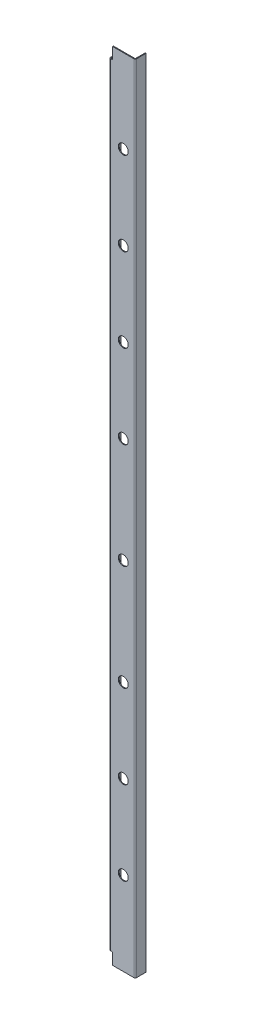
ISO-10303-21;
HEADER;
FILE_DESCRIPTION(('STEP AP214'),'2;1');
FILE_NAME('part.step','',(''),(''),'','','');
FILE_SCHEMA(('AUTOMOTIVE_DESIGN { 1 0 10303 214 1 1 1 1 }'));
ENDSEC;
DATA;
#1=APPLICATION_CONTEXT('core data for automotive mechanical design processes');
#2=APPLICATION_PROTOCOL_DEFINITION('international standard','automotive_design',2000,#1);
#3=PRODUCT_CONTEXT('',#1,'mechanical');
#4=PRODUCT('Part','Part','',(#3));
#5=PRODUCT_RELATED_PRODUCT_CATEGORY('part','',(#4));
#6=PRODUCT_DEFINITION_FORMATION('','',#4);
#7=PRODUCT_DEFINITION_CONTEXT('part definition',#1,'design');
#8=PRODUCT_DEFINITION('design','',#6,#7);
#9=PRODUCT_DEFINITION_SHAPE('','',#8);
#10=(LENGTH_UNIT() NAMED_UNIT(*) SI_UNIT(.MILLI.,.METRE.));
#11=(NAMED_UNIT(*) PLANE_ANGLE_UNIT() SI_UNIT($,.RADIAN.));
#12=(NAMED_UNIT(*) SI_UNIT($,.STERADIAN.) SOLID_ANGLE_UNIT());
#13=UNCERTAINTY_MEASURE_WITH_UNIT(LENGTH_MEASURE(1.E-05),#10,'distance_accuracy_value','');
#14=(GEOMETRIC_REPRESENTATION_CONTEXT(3) GLOBAL_UNCERTAINTY_ASSIGNED_CONTEXT((#13)) GLOBAL_UNIT_ASSIGNED_CONTEXT((#10,
#11,#12)) REPRESENTATION_CONTEXT('',''));
#15=CARTESIAN_POINT('',(0.,0.,0.));
#16=DIRECTION('',(0.,0.,1.));
#17=DIRECTION('',(1.,0.,0.));
#18=AXIS2_PLACEMENT_3D('',#15,#16,#17);
#19=CARTESIAN_POINT('',(-1.2,17.5,-15.));
#20=DIRECTION('',(0.,1.,0.));
#21=DIRECTION('',(0.,0.,1.));
#22=AXIS2_PLACEMENT_3D('',#19,#20,#21);
#23=PLANE('',#22);
#24=DIRECTION('',(0.,0.,1.));
#25=VECTOR('',#24,1.);
#26=CARTESIAN_POINT('',(0.,17.5000000000001,0.));
#27=LINE('',#26,#25);
#28=CARTESIAN_POINT('',(0.,17.5,-15.));
#29=VERTEX_POINT('',#28);
#30=CARTESIAN_POINT('',(0.,17.5000000000001,-0.7));
#31=VERTEX_POINT('',#30);
#32=EDGE_CURVE('E435',#29,#31,#27,.T.);
#33=ORIENTED_EDGE('',*,*,#32,.T.);
#34=DIRECTION('',(-1.,0.,0.));
#35=VECTOR('',#34,1.);
#36=CARTESIAN_POINT('',(0.,17.5000000000001,-0.7));
#37=LINE('',#36,#35);
#38=CARTESIAN_POINT('',(-1.2,17.5000000000001,-0.7));
#39=VERTEX_POINT('',#38);
#40=EDGE_CURVE('E12',#31,#39,#37,.T.);
#41=ORIENTED_EDGE('',*,*,#40,.T.);
#42=DIRECTION('',(0.,0.,1.));
#43=VECTOR('',#42,1.);
#44=CARTESIAN_POINT('',(-1.2,17.5,-15.));
#45=LINE('',#44,#43);
#46=CARTESIAN_POINT('',(-1.2,17.5,-15.));
#47=VERTEX_POINT('',#46);
#48=EDGE_CURVE('E161',#47,#39,#45,.T.);
#49=ORIENTED_EDGE('',*,*,#48,.F.);
#50=DIRECTION('',(-1.,0.,0.));
#51=VECTOR('',#50,1.);
#52=CARTESIAN_POINT('',(-1.2,17.5,-15.));
#53=LINE('',#52,#51);
#54=EDGE_CURVE('E164',#29,#47,#53,.T.);
#55=ORIENTED_EDGE('',*,*,#54,.F.);
#56=EDGE_LOOP('',(#33,#41,#49,#55));
#57=FACE_BOUND('',#56,.T.);
#58=ADVANCED_FACE('F45',(#57),#23,.F.);
#59=DIRECTION('',(-1.,0.,0.));
#60=VECTOR('',#59,1.);
#61=CARTESIAN_POINT('',(-1.2,17.5,1.2));
#62=LINE('',#61,#60);
#63=CARTESIAN_POINT('',(3.8,17.5,1.2));
#64=VERTEX_POINT('',#63);
#65=CARTESIAN_POINT('',(0.7,17.5,1.2));
#66=VERTEX_POINT('',#65);
#67=EDGE_CURVE('E184',#64,#66,#62,.T.);
#68=ORIENTED_EDGE('',*,*,#67,.T.);
#69=DIRECTION('',(0.,0.,-1.));
#70=VECTOR('',#69,1.);
#71=CARTESIAN_POINT('',(0.7,17.5,1.2));
#72=LINE('',#71,#70);
#73=CARTESIAN_POINT('',(0.7,17.5000000000001,0.));
#74=VERTEX_POINT('',#73);
#75=EDGE_CURVE('E55',#66,#74,#72,.T.);
#76=ORIENTED_EDGE('',*,*,#75,.T.);
#77=DIRECTION('',(1.,0.,0.));
#78=VECTOR('',#77,1.);
#79=CARTESIAN_POINT('',(0.,17.5000000000001,0.));
#80=LINE('',#79,#78);
#81=CARTESIAN_POINT('',(3.8,17.5,0.));
#82=VERTEX_POINT('',#81);
#83=EDGE_CURVE('E385',#74,#82,#80,.T.);
#84=ORIENTED_EDGE('',*,*,#83,.T.);
#85=DIRECTION('',(0.,0.,1.));
#86=VECTOR('',#85,1.);
#87=CARTESIAN_POINT('',(3.8,17.5,-15.));
#88=LINE('',#87,#86);
#89=EDGE_CURVE('E173',#82,#64,#88,.T.);
#90=ORIENTED_EDGE('',*,*,#89,.T.);
#91=EDGE_LOOP('',(#68,#76,#84,#90));
#92=FACE_BOUND('',#91,.T.);
#93=ADVANCED_FACE('F407',(#92),#23,.F.);
#94=CARTESIAN_POINT('',(-1.20000000000014,1182.5,-15.));
#95=DIRECTION('',(0.,-1.,0.));
#96=DIRECTION('',(0.,0.,-1.));
#97=AXIS2_PLACEMENT_3D('',#94,#95,#96);
#98=PLANE('',#97);
#99=DIRECTION('',(0.,0.,1.));
#100=VECTOR('',#99,1.);
#101=CARTESIAN_POINT('',(-1.20000000000014,1182.5,-15.));
#102=LINE('',#101,#100);
#103=CARTESIAN_POINT('',(-1.20000000000014,1182.5,-15.));
#104=VERTEX_POINT('',#103);
#105=CARTESIAN_POINT('',(-1.20000000000014,1182.5,-0.699999999999999));
#106=VERTEX_POINT('',#105);
#107=EDGE_CURVE('E189',#104,#106,#102,.T.);
#108=ORIENTED_EDGE('',*,*,#107,.T.);
#109=DIRECTION('',(1.,0.,0.));
#110=VECTOR('',#109,1.);
#111=CARTESIAN_POINT('',(-1.20000000000014,1182.5,-0.699999999999999));
#112=LINE('',#111,#110);
#113=CARTESIAN_POINT('',(0.,1182.5,-0.7));
#114=VERTEX_POINT('',#113);
#115=EDGE_CURVE('E252',#106,#114,#112,.T.);
#116=ORIENTED_EDGE('',*,*,#115,.T.);
#117=DIRECTION('',(0.,0.,-1.));
#118=VECTOR('',#117,1.);
#119=CARTESIAN_POINT('',(0.,1182.5,0.));
#120=LINE('',#119,#118);
#121=CARTESIAN_POINT('',(0.,1182.5,-15.));
#122=VERTEX_POINT('',#121);
#123=EDGE_CURVE('E449',#114,#122,#120,.T.);
#124=ORIENTED_EDGE('',*,*,#123,.T.);
#125=DIRECTION('',(1.,0.,0.));
#126=VECTOR('',#125,1.);
#127=CARTESIAN_POINT('',(-1.20000000000014,1182.5,-15.));
#128=LINE('',#127,#126);
#129=EDGE_CURVE('E526',#104,#122,#128,.T.);
#130=ORIENTED_EDGE('',*,*,#129,.F.);
#131=EDGE_LOOP('',(#108,#116,#124,#130));
#132=FACE_BOUND('',#131,.T.);
#133=ADVANCED_FACE('F413',(#132),#98,.F.);
#134=DIRECTION('',(-1.,0.,0.));
#135=VECTOR('',#134,1.);
#136=CARTESIAN_POINT('',(0.,1182.5,0.));
#137=LINE('',#136,#135);
#138=CARTESIAN_POINT('',(3.79999999999986,1182.5,0.));
#139=VERTEX_POINT('',#138);
#140=CARTESIAN_POINT('',(0.7,1182.5,0.));
#141=VERTEX_POINT('',#140);
#142=EDGE_CURVE('E462',#139,#141,#137,.T.);
#143=ORIENTED_EDGE('',*,*,#142,.T.);
#144=DIRECTION('',(0.,0.,1.));
#145=VECTOR('',#144,1.);
#146=CARTESIAN_POINT('',(0.7,1182.5,0.));
#147=LINE('',#146,#145);
#148=CARTESIAN_POINT('',(0.7,1182.5,1.2));
#149=VERTEX_POINT('',#148);
#150=EDGE_CURVE('E63',#141,#149,#147,.T.);
#151=ORIENTED_EDGE('',*,*,#150,.T.);
#152=DIRECTION('',(-1.,0.,0.));
#153=VECTOR('',#152,1.);
#154=CARTESIAN_POINT('',(0.,1182.5,1.2));
#155=LINE('',#154,#153);
#156=CARTESIAN_POINT('',(3.79999999999986,1182.5,1.2));
#157=VERTEX_POINT('',#156);
#158=EDGE_CURVE('E246',#157,#149,#155,.T.);
#159=ORIENTED_EDGE('',*,*,#158,.F.);
#160=DIRECTION('',(0.,0.,1.));
#161=VECTOR('',#160,1.);
#162=CARTESIAN_POINT('',(3.79999999999986,1182.5,-15.));
#163=LINE('',#162,#161);
#164=EDGE_CURVE('E528',#139,#157,#163,.T.);
#165=ORIENTED_EDGE('',*,*,#164,.F.);
#166=EDGE_LOOP('',(#143,#151,#159,#165));
#167=FACE_BOUND('',#166,.T.);
#168=ADVANCED_FACE('F511',(#167),#98,.F.);
#169=CARTESIAN_POINT('',(-1.2,1200.,-0.7));
#170=DIRECTION('',(0.,1.,0.));
#171=DIRECTION('',(0.,0.,1.));
#172=AXIS2_PLACEMENT_3D('',#169,#170,#171);
#173=PLANE('',#172);
#174=DIRECTION('',(0.,0.,1.));
#175=VECTOR('',#174,1.);
#176=CARTESIAN_POINT('',(3.79999999999985,1200.,-15.));
#177=LINE('',#176,#175);
#178=CARTESIAN_POINT('',(3.79999999999985,1200.,0.));
#179=VERTEX_POINT('',#178);
#180=CARTESIAN_POINT('',(3.79999999999985,1200.,1.2));
#181=VERTEX_POINT('',#180);
#182=EDGE_CURVE('E540',#179,#181,#177,.T.);
#183=ORIENTED_EDGE('',*,*,#182,.T.);
#184=DIRECTION('',(1.,0.,0.));
#185=VECTOR('',#184,1.);
#186=CARTESIAN_POINT('',(0.,1200.,1.2));
#187=LINE('',#186,#185);
#188=CARTESIAN_POINT('',(36.,1200.,1.2));
#189=VERTEX_POINT('',#188);
#190=EDGE_CURVE('E372',#181,#189,#187,.T.);
#191=ORIENTED_EDGE('',*,*,#190,.T.);
#192=DIRECTION('',(0.,0.,-1.));
#193=VECTOR('',#192,1.);
#194=CARTESIAN_POINT('',(36.,1200.,1.2));
#195=LINE('',#194,#193);
#196=CARTESIAN_POINT('',(36.,1200.,0.));
#197=VERTEX_POINT('',#196);
#198=EDGE_CURVE('E239',#189,#197,#195,.T.);
#199=ORIENTED_EDGE('',*,*,#198,.T.);
#200=DIRECTION('',(1.,0.,0.));
#201=VECTOR('',#200,1.);
#202=CARTESIAN_POINT('',(0.,1200.,0.));
#203=LINE('',#202,#201);
#204=EDGE_CURVE('E379',#179,#197,#203,.T.);
#205=ORIENTED_EDGE('',*,*,#204,.F.);
#206=EDGE_LOOP('',(#183,#191,#199,#205));
#207=FACE_BOUND('',#206,.T.);
#208=ADVANCED_FACE('F47',(#207),#173,.T.);
#209=CARTESIAN_POINT('',(36.7,1200.,-0.7));
#210=DIRECTION('',(0.,1.,0.));
#211=DIRECTION('',(0.,0.,1.));
#212=AXIS2_PLACEMENT_3D('',#209,#210,#211);
#213=PLANE('',#212);
#214=DIRECTION('',(1.,0.,0.));
#215=VECTOR('',#214,1.);
#216=CARTESIAN_POINT('',(36.7,1200.,-0.7));
#217=LINE('',#216,#215);
#218=CARTESIAN_POINT('',(36.7,1200.,-0.7));
#219=VERTEX_POINT('',#218);
#220=CARTESIAN_POINT('',(37.9,1200.,-0.7));
#221=VERTEX_POINT('',#220);
#222=EDGE_CURVE('E243',#219,#221,#217,.T.);
#223=ORIENTED_EDGE('',*,*,#222,.F.);
#224=CARTESIAN_POINT('',(36.,1200.,-0.7));
#225=DIRECTION('',(0.,-1.,0.));
#226=DIRECTION('',(0.,0.,-1.));
#227=AXIS2_PLACEMENT_3D('',#224,#225,#226);
#228=CIRCLE('',#227,0.7);
#229=EDGE_CURVE('E325',#197,#219,#228,.F.);
#230=ORIENTED_EDGE('',*,*,#229,.F.);
#231=ORIENTED_EDGE('',*,*,#198,.F.);
#232=CARTESIAN_POINT('',(36.,1200.,-0.7));
#233=DIRECTION('',(0.,1.,0.));
#234=DIRECTION('',(1.,0.,0.));
#235=AXIS2_PLACEMENT_3D('',#232,#233,#234);
#236=CIRCLE('',#235,1.9);
#237=EDGE_CURVE('E361',#189,#221,#236,.T.);
#238=ORIENTED_EDGE('',*,*,#237,.T.);
#239=EDGE_LOOP('',(#223,#230,#231,#238));
#240=FACE_BOUND('',#239,.T.);
#241=ADVANCED_FACE('F498',(#240),#213,.T.);
#242=CARTESIAN_POINT('',(36.,1200.,1.2));
#243=DIRECTION('',(0.,1.,0.));
#244=DIRECTION('',(0.,0.,1.));
#245=AXIS2_PLACEMENT_3D('',#242,#243,#244);
#246=PLANE('',#245);
#247=DIRECTION('',(0.,0.,-1.));
#248=VECTOR('',#247,1.);
#249=CARTESIAN_POINT('',(36.7,1200.,0.));
#250=LINE('',#249,#248);
#251=CARTESIAN_POINT('',(36.7,1200.,-15.));
#252=VERTEX_POINT('',#251);
#253=EDGE_CURVE('E484',#219,#252,#250,.T.);
#254=ORIENTED_EDGE('',*,*,#253,.F.);
#255=ORIENTED_EDGE('',*,*,#222,.T.);
#256=DIRECTION('',(0.,0.,-1.));
#257=VECTOR('',#256,1.);
#258=CARTESIAN_POINT('',(37.9,1200.,0.));
#259=LINE('',#258,#257);
#260=CARTESIAN_POINT('',(37.9,1200.,-15.));
#261=VERTEX_POINT('',#260);
#262=EDGE_CURVE('E356',#221,#261,#259,.T.);
#263=ORIENTED_EDGE('',*,*,#262,.T.);
#264=DIRECTION('',(1.,0.,0.));
#265=VECTOR('',#264,1.);
#266=CARTESIAN_POINT('',(36.7,1200.,-15.));
#267=LINE('',#266,#265);
#268=EDGE_CURVE('E394',#252,#261,#267,.T.);
#269=ORIENTED_EDGE('',*,*,#268,.F.);
#270=EDGE_LOOP('',(#254,#255,#263,#269));
#271=FACE_BOUND('',#270,.T.);
#272=ADVANCED_FACE('F500',(#271),#246,.T.);
#273=CARTESIAN_POINT('',(36.,0.,0.));
#274=DIRECTION('',(0.,-1.,0.));
#275=DIRECTION('',(0.,0.,-1.));
#276=AXIS2_PLACEMENT_3D('',#273,#274,#275);
#277=PLANE('',#276);
#278=DIRECTION('',(0.,0.,1.));
#279=VECTOR('',#278,1.);
#280=CARTESIAN_POINT('',(36.,0.,0.));
#281=LINE('',#280,#279);
#282=CARTESIAN_POINT('',(36.,0.,0.));
#283=VERTEX_POINT('',#282);
#284=CARTESIAN_POINT('',(36.,0.,1.2));
#285=VERTEX_POINT('',#284);
#286=EDGE_CURVE('E235',#283,#285,#281,.T.);
#287=ORIENTED_EDGE('',*,*,#286,.F.);
#288=CARTESIAN_POINT('',(36.,0.,-0.7));
#289=DIRECTION('',(0.,-1.,0.));
#290=DIRECTION('',(0.,0.,-1.));
#291=AXIS2_PLACEMENT_3D('',#288,#289,#290);
#292=CIRCLE('',#291,0.7);
#293=CARTESIAN_POINT('',(36.7,0.,-0.7));
#294=VERTEX_POINT('',#293);
#295=EDGE_CURVE('E323',#283,#294,#292,.F.);
#296=ORIENTED_EDGE('',*,*,#295,.T.);
#297=DIRECTION('',(-1.,0.,0.));
#298=VECTOR('',#297,1.);
#299=CARTESIAN_POINT('',(37.9,0.,-0.7));
#300=LINE('',#299,#298);
#301=CARTESIAN_POINT('',(37.9,0.,-0.7));
#302=VERTEX_POINT('',#301);
#303=EDGE_CURVE('E230',#302,#294,#300,.T.);
#304=ORIENTED_EDGE('',*,*,#303,.F.);
#305=CARTESIAN_POINT('',(36.,0.,-0.7));
#306=DIRECTION('',(0.,1.,0.));
#307=DIRECTION('',(1.,0.,0.));
#308=AXIS2_PLACEMENT_3D('',#305,#306,#307);
#309=CIRCLE('',#308,1.9);
#310=EDGE_CURVE('E354',#285,#302,#309,.T.);
#311=ORIENTED_EDGE('',*,*,#310,.F.);
#312=EDGE_LOOP('',(#287,#296,#304,#311));
#313=FACE_BOUND('',#312,.T.);
#314=ADVANCED_FACE('F340',(#313),#277,.T.);
#315=CARTESIAN_POINT('',(37.9,0.,-0.7));
#316=DIRECTION('',(0.,-1.,0.));
#317=DIRECTION('',(0.,0.,-1.));
#318=AXIS2_PLACEMENT_3D('',#315,#316,#317);
#319=PLANE('',#318);
#320=DIRECTION('',(0.,0.,1.));
#321=VECTOR('',#320,1.);
#322=CARTESIAN_POINT('',(3.8,0.,-15.));
#323=LINE('',#322,#321);
#324=CARTESIAN_POINT('',(3.8,0.,0.));
#325=VERTEX_POINT('',#324);
#326=CARTESIAN_POINT('',(3.8,0.,1.2));
#327=VERTEX_POINT('',#326);
#328=EDGE_CURVE('E71',#325,#327,#323,.T.);
#329=ORIENTED_EDGE('',*,*,#328,.F.);
#330=DIRECTION('',(1.,0.,0.));
#331=VECTOR('',#330,1.);
#332=CARTESIAN_POINT('',(0.,0.,0.));
#333=LINE('',#332,#331);
#334=EDGE_CURVE('E344',#325,#283,#333,.T.);
#335=ORIENTED_EDGE('',*,*,#334,.T.);
#336=ORIENTED_EDGE('',*,*,#286,.T.);
#337=DIRECTION('',(1.,0.,0.));
#338=VECTOR('',#337,1.);
#339=CARTESIAN_POINT('',(0.,0.,1.2));
#340=LINE('',#339,#338);
#341=EDGE_CURVE('E348',#327,#285,#340,.T.);
#342=ORIENTED_EDGE('',*,*,#341,.F.);
#343=EDGE_LOOP('',(#329,#335,#336,#342));
#344=FACE_BOUND('',#343,.T.);
#345=ADVANCED_FACE('F397',(#344),#319,.T.);
#346=CARTESIAN_POINT('',(37.9,1200.,0.));
#347=DIRECTION('',(-1.,0.,0.));
#348=DIRECTION('',(0.,0.,1.));
#349=AXIS2_PLACEMENT_3D('',#346,#347,#348);
#350=PLANE('',#349);
#351=DIRECTION('',(0.,0.,-1.));
#352=VECTOR('',#351,1.);
#353=CARTESIAN_POINT('',(37.9,0.,0.));
#354=LINE('',#353,#352);
#355=CARTESIAN_POINT('',(37.9,0.,-15.));
#356=VERTEX_POINT('',#355);
#357=EDGE_CURVE('E383',#302,#356,#354,.T.);
#358=ORIENTED_EDGE('',*,*,#357,.T.);
#359=DIRECTION('',(0.,-1.,0.));
#360=VECTOR('',#359,1.);
#361=CARTESIAN_POINT('',(37.9,1200.,-15.));
#362=LINE('',#361,#360);
#363=EDGE_CURVE('E223',#261,#356,#362,.T.);
#364=ORIENTED_EDGE('',*,*,#363,.F.);
#365=ORIENTED_EDGE('',*,*,#262,.F.);
#366=DIRECTION('',(0.,-1.,0.));
#367=VECTOR('',#366,1.);
#368=CARTESIAN_POINT('',(37.9,1200.,-0.7));
#369=LINE('',#368,#367);
#370=EDGE_CURVE('E357',#221,#302,#369,.T.);
#371=ORIENTED_EDGE('',*,*,#370,.T.);
#372=EDGE_LOOP('',(#358,#364,#365,#371));
#373=FACE_BOUND('',#372,.T.);
#374=ADVANCED_FACE('F395',(#373),#350,.F.);
#375=CARTESIAN_POINT('',(36.7,1200.,-15.));
#376=DIRECTION('',(0.,0.,-1.));
#377=DIRECTION('',(-1.,0.,0.));
#378=AXIS2_PLACEMENT_3D('',#375,#376,#377);
#379=PLANE('',#378);
#380=DIRECTION('',(1.,0.,0.));
#381=VECTOR('',#380,1.);
#382=CARTESIAN_POINT('',(36.7,0.,-15.));
#383=LINE('',#382,#381);
#384=CARTESIAN_POINT('',(36.7,0.,-15.));
#385=VERTEX_POINT('',#384);
#386=EDGE_CURVE('E336',#385,#356,#383,.T.);
#387=ORIENTED_EDGE('',*,*,#386,.F.);
#388=DIRECTION('',(0.,-1.,0.));
#389=VECTOR('',#388,1.);
#390=CARTESIAN_POINT('',(36.7,1200.,-15.));
#391=LINE('',#390,#389);
#392=EDGE_CURVE('E218',#252,#385,#391,.T.);
#393=ORIENTED_EDGE('',*,*,#392,.F.);
#394=ORIENTED_EDGE('',*,*,#268,.T.);
#395=ORIENTED_EDGE('',*,*,#363,.T.);
#396=EDGE_LOOP('',(#387,#393,#394,#395));
#397=FACE_BOUND('',#396,.T.);
#398=ADVANCED_FACE('F390',(#397),#379,.T.);
#399=CARTESIAN_POINT('',(36.7,1200.,0.));
#400=DIRECTION('',(-1.,0.,0.));
#401=DIRECTION('',(0.,0.,1.));
#402=AXIS2_PLACEMENT_3D('',#399,#400,#401);
#403=PLANE('',#402);
#404=DIRECTION('',(0.,0.,-1.));
#405=VECTOR('',#404,1.);
#406=CARTESIAN_POINT('',(36.7,0.,0.));
#407=LINE('',#406,#405);
#408=EDGE_CURVE('E330',#294,#385,#407,.T.);
#409=ORIENTED_EDGE('',*,*,#408,.F.);
#410=DIRECTION('',(0.,-1.,0.));
#411=VECTOR('',#410,1.);
#412=CARTESIAN_POINT('',(36.7,1200.,-0.7));
#413=LINE('',#412,#411);
#414=EDGE_CURVE('E224',#219,#294,#413,.T.);
#415=ORIENTED_EDGE('',*,*,#414,.F.);
#416=ORIENTED_EDGE('',*,*,#253,.T.);
#417=ORIENTED_EDGE('',*,*,#392,.T.);
#418=EDGE_LOOP('',(#409,#415,#416,#417));
#419=FACE_BOUND('',#418,.T.);
#420=ADVANCED_FACE('F331',(#419),#403,.T.);
#421=CARTESIAN_POINT('',(36.,1200.,-0.7));
#422=DIRECTION('',(0.,-1.,0.));
#423=DIRECTION('',(0.,0.,-1.));
#424=AXIS2_PLACEMENT_3D('',#421,#422,#423);
#425=CYLINDRICAL_SURFACE('',#424,0.7);
#426=ORIENTED_EDGE('',*,*,#295,.F.);
#427=DIRECTION('',(0.,-1.,0.));
#428=VECTOR('',#427,1.);
#429=CARTESIAN_POINT('',(36.,1200.,0.));
#430=LINE('',#429,#428);
#431=EDGE_CURVE('E305',#197,#283,#430,.T.);
#432=ORIENTED_EDGE('',*,*,#431,.F.);
#433=ORIENTED_EDGE('',*,*,#229,.T.);
#434=ORIENTED_EDGE('',*,*,#414,.T.);
#435=EDGE_LOOP('',(#426,#432,#433,#434));
#436=FACE_BOUND('',#435,.T.);
#437=ADVANCED_FACE('F321',(#436),#425,.F.);
#438=CARTESIAN_POINT('',(0.,1200.,0.));
#439=DIRECTION('',(0.,0.,-1.));
#440=DIRECTION('',(-1.,0.,0.));
#441=AXIS2_PLACEMENT_3D('',#438,#439,#440);
#442=PLANE('',#441);
#443=CARTESIAN_POINT('',(19.9,126.,0.));
#444=DIRECTION('',(0.,0.,-1.));
#445=DIRECTION('',(-1.,0.,0.));
#446=AXIS2_PLACEMENT_3D('',#443,#444,#445);
#447=CIRCLE('',#446,7.5);
#448=CARTESIAN_POINT('',(12.4,126.,0.));
#449=VERTEX_POINT('',#448);
#450=EDGE_CURVE('E556',#449,#449,#447,.T.);
#451=ORIENTED_EDGE('',*,*,#450,.F.);
#452=EDGE_LOOP('',(#451));
#453=FACE_BOUND('',#452,.T.);
#454=CARTESIAN_POINT('',(19.9,537.,0.));
#455=DIRECTION('',(0.,0.,-1.));
#456=DIRECTION('',(-1.,0.,0.));
#457=AXIS2_PLACEMENT_3D('',#454,#455,#456);
#458=CIRCLE('',#457,7.5);
#459=CARTESIAN_POINT('',(12.4,537.,0.));
#460=VERTEX_POINT('',#459);
#461=EDGE_CURVE('E567',#460,#460,#458,.T.);
#462=ORIENTED_EDGE('',*,*,#461,.F.);
#463=EDGE_LOOP('',(#462));
#464=FACE_BOUND('',#463,.T.);
#465=CARTESIAN_POINT('',(19.9,696.,0.));
#466=DIRECTION('',(0.,0.,-1.));
#467=DIRECTION('',(-1.,0.,0.));
#468=AXIS2_PLACEMENT_3D('',#465,#466,#467);
#469=CIRCLE('',#468,7.5);
#470=CARTESIAN_POINT('',(12.4,696.,0.));
#471=VERTEX_POINT('',#470);
#472=EDGE_CURVE('E572',#471,#471,#469,.T.);
#473=ORIENTED_EDGE('',*,*,#472,.F.);
#474=EDGE_LOOP('',(#473));
#475=FACE_BOUND('',#474,.T.);
#476=CARTESIAN_POINT('',(19.9,822.,0.));
#477=DIRECTION('',(0.,0.,-1.));
#478=DIRECTION('',(-1.,0.,0.));
#479=AXIS2_PLACEMENT_3D('',#476,#477,#478);
#480=CIRCLE('',#479,7.5);
#481=CARTESIAN_POINT('',(12.4,822.,0.));
#482=VERTEX_POINT('',#481);
#483=EDGE_CURVE('E282',#482,#482,#480,.T.);
#484=ORIENTED_EDGE('',*,*,#483,.F.);
#485=EDGE_LOOP('',(#484));
#486=FACE_BOUND('',#485,.T.);
#487=CARTESIAN_POINT('',(19.9,948.,0.));
#488=DIRECTION('',(0.,0.,-1.));
#489=DIRECTION('',(-1.,0.,0.));
#490=AXIS2_PLACEMENT_3D('',#487,#488,#489);
#491=CIRCLE('',#490,7.5);
#492=CARTESIAN_POINT('',(12.4,948.,0.));
#493=VERTEX_POINT('',#492);
#494=EDGE_CURVE('E276',#493,#493,#491,.T.);
#495=ORIENTED_EDGE('',*,*,#494,.F.);
#496=EDGE_LOOP('',(#495));
#497=FACE_BOUND('',#496,.T.);
#498=CARTESIAN_POINT('',(19.8999999999999,1074.,0.));
#499=DIRECTION('',(0.,0.,-1.));
#500=DIRECTION('',(-1.,0.,0.));
#501=AXIS2_PLACEMENT_3D('',#498,#499,#500);
#502=CIRCLE('',#501,7.49999999999997);
#503=CARTESIAN_POINT('',(12.4,1074.,0.));
#504=VERTEX_POINT('',#503);
#505=EDGE_CURVE('E271',#504,#504,#502,.T.);
#506=ORIENTED_EDGE('',*,*,#505,.F.);
#507=EDGE_LOOP('',(#506));
#508=FACE_BOUND('',#507,.T.);
#509=CARTESIAN_POINT('',(19.9,378.,0.));
#510=DIRECTION('',(0.,0.,-1.));
#511=DIRECTION('',(-1.,0.,0.));
#512=AXIS2_PLACEMENT_3D('',#509,#510,#511);
#513=CIRCLE('',#512,7.5);
#514=CARTESIAN_POINT('',(12.4,378.,0.));
#515=VERTEX_POINT('',#514);
#516=EDGE_CURVE('E266',#515,#515,#513,.T.);
#517=ORIENTED_EDGE('',*,*,#516,.F.);
#518=EDGE_LOOP('',(#517));
#519=FACE_BOUND('',#518,.T.);
#520=CARTESIAN_POINT('',(19.9,252.,0.));
#521=DIRECTION('',(0.,0.,-1.));
#522=DIRECTION('',(-1.,0.,0.));
#523=AXIS2_PLACEMENT_3D('',#520,#521,#522);
#524=CIRCLE('',#523,7.5);
#525=CARTESIAN_POINT('',(12.4,252.,0.));
#526=VERTEX_POINT('',#525);
#527=EDGE_CURVE('E261',#526,#526,#524,.T.);
#528=ORIENTED_EDGE('',*,*,#527,.F.);
#529=EDGE_LOOP('',(#528));
#530=FACE_BOUND('',#529,.T.);
#531=ORIENTED_EDGE('',*,*,#83,.F.);
#532=DIRECTION('',(0.,-1.,0.));
#533=VECTOR('',#532,1.);
#534=CARTESIAN_POINT('',(0.7,1200.,0.));
#535=LINE('',#534,#533);
#536=EDGE_CURVE('E301',#141,#74,#535,.T.);
#537=ORIENTED_EDGE('',*,*,#536,.F.);
#538=ORIENTED_EDGE('',*,*,#142,.F.);
#539=DIRECTION('',(0.,-1.,0.));
#540=VECTOR('',#539,1.);
#541=CARTESIAN_POINT('',(3.79999999999985,1200.,0.));
#542=LINE('',#541,#540);
#543=EDGE_CURVE('E470',#179,#139,#542,.T.);
#544=ORIENTED_EDGE('',*,*,#543,.F.);
#545=ORIENTED_EDGE('',*,*,#204,.T.);
#546=ORIENTED_EDGE('',*,*,#431,.T.);
#547=ORIENTED_EDGE('',*,*,#334,.F.);
#548=DIRECTION('',(0.,-1.,0.));
#549=VECTOR('',#548,1.);
#550=CARTESIAN_POINT('',(3.8,1200.,0.));
#551=LINE('',#550,#549);
#552=EDGE_CURVE('E473',#82,#325,#551,.T.);
#553=ORIENTED_EDGE('',*,*,#552,.F.);
#554=EDGE_LOOP('',(#531,#537,#538,#544,#545,#546,#547,#553));
#555=FACE_BOUND('',#554,.T.);
#556=ADVANCED_FACE('F492',(#453,#464,#475,#486,#497,#508,#519,#530,#555),#442,.T.);
#557=CARTESIAN_POINT('',(0.7,1200.,-0.7));
#558=DIRECTION('',(0.,-1.,0.));
#559=DIRECTION('',(0.,0.,-1.));
#560=AXIS2_PLACEMENT_3D('',#557,#558,#559);
#561=CYLINDRICAL_SURFACE('',#560,0.7);
#562=CARTESIAN_POINT('',(0.7,17.5000000000001,-0.7));
#563=DIRECTION('',(0.,1.,0.));
#564=DIRECTION('',(0.,0.,1.));
#565=AXIS2_PLACEMENT_3D('',#562,#563,#564);
#566=CIRCLE('',#565,0.7);
#567=EDGE_CURVE('E431',#31,#74,#566,.T.);
#568=ORIENTED_EDGE('',*,*,#567,.F.);
#569=DIRECTION('',(0.,-1.,0.));
#570=VECTOR('',#569,1.);
#571=CARTESIAN_POINT('',(0.,1200.,-0.7));
#572=LINE('',#571,#570);
#573=EDGE_CURVE('E196',#114,#31,#572,.T.);
#574=ORIENTED_EDGE('',*,*,#573,.F.);
#575=CARTESIAN_POINT('',(0.7,1182.5,-0.7));
#576=DIRECTION('',(0.,-1.,0.));
#577=DIRECTION('',(0.,0.,-1.));
#578=AXIS2_PLACEMENT_3D('',#575,#576,#577);
#579=CIRCLE('',#578,0.7);
#580=EDGE_CURVE('E456',#141,#114,#579,.T.);
#581=ORIENTED_EDGE('',*,*,#580,.F.);
#582=ORIENTED_EDGE('',*,*,#536,.T.);
#583=EDGE_LOOP('',(#568,#574,#581,#582));
#584=FACE_BOUND('',#583,.T.);
#585=ADVANCED_FACE('F442',(#584),#561,.F.);
#586=CARTESIAN_POINT('',(0.,1200.,0.));
#587=DIRECTION('',(1.,0.,0.));
#588=DIRECTION('',(0.,0.,-1.));
#589=AXIS2_PLACEMENT_3D('',#586,#587,#588);
#590=PLANE('',#589);
#591=ORIENTED_EDGE('',*,*,#32,.F.);
#592=DIRECTION('',(0.,-1.,0.));
#593=VECTOR('',#592,1.);
#594=CARTESIAN_POINT('',(0.,1200.,-15.));
#595=LINE('',#594,#593);
#596=EDGE_CURVE('E182',#122,#29,#595,.T.);
#597=ORIENTED_EDGE('',*,*,#596,.F.);
#598=ORIENTED_EDGE('',*,*,#123,.F.);
#599=ORIENTED_EDGE('',*,*,#573,.T.);
#600=EDGE_LOOP('',(#591,#597,#598,#599));
#601=FACE_BOUND('',#600,.T.);
#602=ADVANCED_FACE('F448',(#601),#590,.T.);
#603=CARTESIAN_POINT('',(-1.2,1200.,-15.));
#604=DIRECTION('',(0.,0.,-1.));
#605=DIRECTION('',(-1.,0.,0.));
#606=AXIS2_PLACEMENT_3D('',#603,#604,#605);
#607=PLANE('',#606);
#608=ORIENTED_EDGE('',*,*,#54,.T.);
#609=DIRECTION('',(0.,-1.,0.));
#610=VECTOR('',#609,1.);
#611=CARTESIAN_POINT('',(-1.2,1200.,-15.));
#612=LINE('',#611,#610);
#613=EDGE_CURVE('E180',#104,#47,#612,.T.);
#614=ORIENTED_EDGE('',*,*,#613,.F.);
#615=ORIENTED_EDGE('',*,*,#129,.T.);
#616=ORIENTED_EDGE('',*,*,#596,.T.);
#617=EDGE_LOOP('',(#608,#614,#615,#616));
#618=FACE_BOUND('',#617,.T.);
#619=ADVANCED_FACE('F178',(#618),#607,.T.);
#620=CARTESIAN_POINT('',(-1.2,1200.,0.));
#621=DIRECTION('',(1.,0.,0.));
#622=DIRECTION('',(0.,0.,-1.));
#623=AXIS2_PLACEMENT_3D('',#620,#621,#622);
#624=PLANE('',#623);
#625=ORIENTED_EDGE('',*,*,#613,.T.);
#626=ORIENTED_EDGE('',*,*,#48,.T.);
#627=DIRECTION('',(0.,-1.,0.));
#628=VECTOR('',#627,1.);
#629=CARTESIAN_POINT('',(-1.2,1200.,-0.7));
#630=LINE('',#629,#628);
#631=EDGE_CURVE('E191',#106,#39,#630,.T.);
#632=ORIENTED_EDGE('',*,*,#631,.F.);
#633=ORIENTED_EDGE('',*,*,#107,.F.);
#634=EDGE_LOOP('',(#625,#626,#632,#633));
#635=FACE_BOUND('',#634,.T.);
#636=ADVANCED_FACE('F187',(#635),#624,.F.);
#637=CARTESIAN_POINT('',(0.7,1200.,-0.7));
#638=DIRECTION('',(0.,-1.,0.));
#639=DIRECTION('',(0.,0.,-1.));
#640=AXIS2_PLACEMENT_3D('',#637,#638,#639);
#641=CYLINDRICAL_SURFACE('',#640,1.9);
#642=ORIENTED_EDGE('',*,*,#631,.T.);
#643=CARTESIAN_POINT('',(0.7,17.5000000000001,-0.7));
#644=DIRECTION('',(0.,1.,0.));
#645=DIRECTION('',(0.,0.,1.));
#646=AXIS2_PLACEMENT_3D('',#643,#644,#645);
#647=CIRCLE('',#646,1.9);
#648=EDGE_CURVE('E434',#39,#66,#647,.T.);
#649=ORIENTED_EDGE('',*,*,#648,.T.);
#650=DIRECTION('',(0.,-1.,0.));
#651=VECTOR('',#650,1.);
#652=CARTESIAN_POINT('',(0.7,1200.,1.2));
#653=LINE('',#652,#651);
#654=EDGE_CURVE('E198',#149,#66,#653,.T.);
#655=ORIENTED_EDGE('',*,*,#654,.F.);
#656=CARTESIAN_POINT('',(0.7,1182.5,-0.7));
#657=DIRECTION('',(0.,-1.,0.));
#658=DIRECTION('',(0.,0.,-1.));
#659=AXIS2_PLACEMENT_3D('',#656,#657,#658);
#660=CIRCLE('',#659,1.9);
#661=EDGE_CURVE('E172',#149,#106,#660,.T.);
#662=ORIENTED_EDGE('',*,*,#661,.T.);
#663=EDGE_LOOP('',(#642,#649,#655,#662));
#664=FACE_BOUND('',#663,.T.);
#665=ADVANCED_FACE('F531',(#664),#641,.T.);
#666=CARTESIAN_POINT('',(0.,1200.,1.2));
#667=DIRECTION('',(0.,0.,-1.));
#668=DIRECTION('',(-1.,0.,0.));
#669=AXIS2_PLACEMENT_3D('',#666,#667,#668);
#670=PLANE('',#669);
#671=CARTESIAN_POINT('',(19.9,126.,1.2));
#672=DIRECTION('',(0.,0.,-1.));
#673=DIRECTION('',(-1.,0.,0.));
#674=AXIS2_PLACEMENT_3D('',#671,#672,#673);
#675=CIRCLE('',#674,7.5);
#676=CARTESIAN_POINT('',(12.4,126.,1.2));
#677=VERTEX_POINT('',#676);
#678=EDGE_CURVE('E49',#677,#677,#675,.T.);
#679=ORIENTED_EDGE('',*,*,#678,.T.);
#680=EDGE_LOOP('',(#679));
#681=FACE_BOUND('',#680,.T.);
#682=CARTESIAN_POINT('',(19.9,537.,1.2));
#683=DIRECTION('',(0.,0.,-1.));
#684=DIRECTION('',(-1.,0.,0.));
#685=AXIS2_PLACEMENT_3D('',#682,#683,#684);
#686=CIRCLE('',#685,7.5);
#687=CARTESIAN_POINT('',(12.4,537.,1.2));
#688=VERTEX_POINT('',#687);
#689=EDGE_CURVE('E571',#688,#688,#686,.T.);
#690=ORIENTED_EDGE('',*,*,#689,.T.);
#691=EDGE_LOOP('',(#690));
#692=FACE_BOUND('',#691,.T.);
#693=CARTESIAN_POINT('',(19.9,696.,1.2));
#694=DIRECTION('',(0.,0.,-1.));
#695=DIRECTION('',(-1.,0.,0.));
#696=AXIS2_PLACEMENT_3D('',#693,#694,#695);
#697=CIRCLE('',#696,7.5);
#698=CARTESIAN_POINT('',(12.4,696.,1.2));
#699=VERTEX_POINT('',#698);
#700=EDGE_CURVE('E283',#699,#699,#697,.T.);
#701=ORIENTED_EDGE('',*,*,#700,.T.);
#702=EDGE_LOOP('',(#701));
#703=FACE_BOUND('',#702,.T.);
#704=CARTESIAN_POINT('',(19.9,822.,1.2));
#705=DIRECTION('',(0.,0.,-1.));
#706=DIRECTION('',(-1.,0.,0.));
#707=AXIS2_PLACEMENT_3D('',#704,#705,#706);
#708=CIRCLE('',#707,7.5);
#709=CARTESIAN_POINT('',(12.4,822.,1.2));
#710=VERTEX_POINT('',#709);
#711=EDGE_CURVE('E277',#710,#710,#708,.T.);
#712=ORIENTED_EDGE('',*,*,#711,.T.);
#713=EDGE_LOOP('',(#712));
#714=FACE_BOUND('',#713,.T.);
#715=CARTESIAN_POINT('',(19.9,948.,1.2));
#716=DIRECTION('',(0.,0.,-1.));
#717=DIRECTION('',(-1.,0.,0.));
#718=AXIS2_PLACEMENT_3D('',#715,#716,#717);
#719=CIRCLE('',#718,7.5);
#720=CARTESIAN_POINT('',(12.4,948.,1.2));
#721=VERTEX_POINT('',#720);
#722=EDGE_CURVE('E272',#721,#721,#719,.T.);
#723=ORIENTED_EDGE('',*,*,#722,.T.);
#724=EDGE_LOOP('',(#723));
#725=FACE_BOUND('',#724,.T.);
#726=CARTESIAN_POINT('',(19.8999999999999,1074.,1.2));
#727=DIRECTION('',(0.,0.,-1.));
#728=DIRECTION('',(-1.,0.,0.));
#729=AXIS2_PLACEMENT_3D('',#726,#727,#728);
#730=CIRCLE('',#729,7.49999999999997);
#731=CARTESIAN_POINT('',(12.4,1074.,1.2));
#732=VERTEX_POINT('',#731);
#733=EDGE_CURVE('E267',#732,#732,#730,.T.);
#734=ORIENTED_EDGE('',*,*,#733,.T.);
#735=EDGE_LOOP('',(#734));
#736=FACE_BOUND('',#735,.T.);
#737=CARTESIAN_POINT('',(19.9,378.,1.2));
#738=DIRECTION('',(0.,0.,-1.));
#739=DIRECTION('',(-1.,0.,0.));
#740=AXIS2_PLACEMENT_3D('',#737,#738,#739);
#741=CIRCLE('',#740,7.5);
#742=CARTESIAN_POINT('',(12.4,378.,1.2));
#743=VERTEX_POINT('',#742);
#744=EDGE_CURVE('E262',#743,#743,#741,.T.);
#745=ORIENTED_EDGE('',*,*,#744,.T.);
#746=EDGE_LOOP('',(#745));
#747=FACE_BOUND('',#746,.T.);
#748=CARTESIAN_POINT('',(19.9,252.,1.2));
#749=DIRECTION('',(0.,0.,-1.));
#750=DIRECTION('',(-1.,0.,0.));
#751=AXIS2_PLACEMENT_3D('',#748,#749,#750);
#752=CIRCLE('',#751,7.5);
#753=CARTESIAN_POINT('',(12.4,252.,1.2));
#754=VERTEX_POINT('',#753);
#755=EDGE_CURVE('E257',#754,#754,#752,.T.);
#756=ORIENTED_EDGE('',*,*,#755,.T.);
#757=EDGE_LOOP('',(#756));
#758=FACE_BOUND('',#757,.T.);
#759=ORIENTED_EDGE('',*,*,#654,.T.);
#760=ORIENTED_EDGE('',*,*,#67,.F.);
#761=DIRECTION('',(0.,1.,0.));
#762=VECTOR('',#761,1.);
#763=CARTESIAN_POINT('',(3.8,0.,1.2));
#764=LINE('',#763,#762);
#765=EDGE_CURVE('E544',#327,#64,#764,.T.);
#766=ORIENTED_EDGE('',*,*,#765,.F.);
#767=ORIENTED_EDGE('',*,*,#341,.T.);
#768=DIRECTION('',(0.,-1.,0.));
#769=VECTOR('',#768,1.);
#770=CARTESIAN_POINT('',(36.,1200.,1.2));
#771=LINE('',#770,#769);
#772=EDGE_CURVE('E293',#189,#285,#771,.T.);
#773=ORIENTED_EDGE('',*,*,#772,.F.);
#774=ORIENTED_EDGE('',*,*,#190,.F.);
#775=DIRECTION('',(0.,1.,0.));
#776=VECTOR('',#775,1.);
#777=CARTESIAN_POINT('',(3.79999999999985,1200.,1.2));
#778=LINE('',#777,#776);
#779=EDGE_CURVE('E537',#157,#181,#778,.T.);
#780=ORIENTED_EDGE('',*,*,#779,.F.);
#781=ORIENTED_EDGE('',*,*,#158,.T.);
#782=EDGE_LOOP('',(#759,#760,#766,#767,#773,#774,#780,#781));
#783=FACE_BOUND('',#782,.T.);
#784=ADVANCED_FACE('F534',(#681,#692,#703,#714,#725,#736,#747,#758,#783),#670,.F.);
#785=CARTESIAN_POINT('',(36.,1200.,-0.7));
#786=DIRECTION('',(0.,-1.,0.));
#787=DIRECTION('',(0.,0.,-1.));
#788=AXIS2_PLACEMENT_3D('',#785,#786,#787);
#789=CYLINDRICAL_SURFACE('',#788,1.9);
#790=ORIENTED_EDGE('',*,*,#310,.T.);
#791=ORIENTED_EDGE('',*,*,#370,.F.);
#792=ORIENTED_EDGE('',*,*,#237,.F.);
#793=ORIENTED_EDGE('',*,*,#772,.T.);
#794=EDGE_LOOP('',(#790,#791,#792,#793));
#795=FACE_BOUND('',#794,.T.);
#796=ADVANCED_FACE('F525',(#795),#789,.T.);
#797=CARTESIAN_POINT('',(36.,0.,-0.7));
#798=DIRECTION('',(0.,-1.,0.));
#799=DIRECTION('',(-1.,0.,0.));
#800=AXIS2_PLACEMENT_3D('',#797,#798,#799);
#801=PLANE('',#800);
#802=ORIENTED_EDGE('',*,*,#357,.F.);
#803=ORIENTED_EDGE('',*,*,#303,.T.);
#804=ORIENTED_EDGE('',*,*,#408,.T.);
#805=ORIENTED_EDGE('',*,*,#386,.T.);
#806=EDGE_LOOP('',(#802,#803,#804,#805));
#807=FACE_BOUND('',#806,.T.);
#808=ADVANCED_FACE('F388',(#807),#801,.T.);
#809=ORIENTED_EDGE('',*,*,#115,.F.);
#810=ORIENTED_EDGE('',*,*,#661,.F.);
#811=ORIENTED_EDGE('',*,*,#150,.F.);
#812=ORIENTED_EDGE('',*,*,#580,.T.);
#813=EDGE_LOOP('',(#809,#810,#811,#812));
#814=FACE_BOUND('',#813,.T.);
#815=ADVANCED_FACE('F426',(#814),#98,.F.);
#816=CARTESIAN_POINT('',(3.79999999999985,1200.,-15.));
#817=DIRECTION('',(1.,0.,0.));
#818=DIRECTION('',(0.,1.,0.));
#819=AXIS2_PLACEMENT_3D('',#816,#817,#818);
#820=PLANE('',#819);
#821=ORIENTED_EDGE('',*,*,#543,.T.);
#822=ORIENTED_EDGE('',*,*,#164,.T.);
#823=ORIENTED_EDGE('',*,*,#779,.T.);
#824=ORIENTED_EDGE('',*,*,#182,.F.);
#825=EDGE_LOOP('',(#821,#822,#823,#824));
#826=FACE_BOUND('',#825,.T.);
#827=ADVANCED_FACE('F419',(#826),#820,.F.);
#828=ORIENTED_EDGE('',*,*,#40,.F.);
#829=ORIENTED_EDGE('',*,*,#567,.T.);
#830=ORIENTED_EDGE('',*,*,#75,.F.);
#831=ORIENTED_EDGE('',*,*,#648,.F.);
#832=EDGE_LOOP('',(#828,#829,#830,#831));
#833=FACE_BOUND('',#832,.T.);
#834=ADVANCED_FACE('F409',(#833),#23,.F.);
#835=CARTESIAN_POINT('',(3.8,0.,-15.));
#836=DIRECTION('',(1.,0.,0.));
#837=DIRECTION('',(0.,0.,-1.));
#838=AXIS2_PLACEMENT_3D('',#835,#836,#837);
#839=PLANE('',#838);
#840=ORIENTED_EDGE('',*,*,#552,.T.);
#841=ORIENTED_EDGE('',*,*,#328,.T.);
#842=ORIENTED_EDGE('',*,*,#765,.T.);
#843=ORIENTED_EDGE('',*,*,#89,.F.);
#844=EDGE_LOOP('',(#840,#841,#842,#843));
#845=FACE_BOUND('',#844,.T.);
#846=ADVANCED_FACE('F418',(#845),#839,.F.);
#847=CARTESIAN_POINT('',(19.9,252.,-15.));
#848=DIRECTION('',(0.,0.,1.));
#849=DIRECTION('',(1.,0.,0.));
#850=AXIS2_PLACEMENT_3D('',#847,#848,#849);
#851=CYLINDRICAL_SURFACE('',#850,7.5);
#852=ORIENTED_EDGE('',*,*,#527,.T.);
#853=EDGE_LOOP('',(#852));
#854=FACE_BOUND('',#853,.T.);
#855=ORIENTED_EDGE('',*,*,#755,.F.);
#856=EDGE_LOOP('',(#855));
#857=FACE_BOUND('',#856,.T.);
#858=ADVANCED_FACE('F425',(#854,#857),#851,.F.);
#859=CARTESIAN_POINT('',(19.9,378.,-15.));
#860=DIRECTION('',(0.,0.,1.));
#861=DIRECTION('',(1.,0.,0.));
#862=AXIS2_PLACEMENT_3D('',#859,#860,#861);
#863=CYLINDRICAL_SURFACE('',#862,7.5);
#864=ORIENTED_EDGE('',*,*,#516,.T.);
#865=EDGE_LOOP('',(#864));
#866=FACE_BOUND('',#865,.T.);
#867=ORIENTED_EDGE('',*,*,#744,.F.);
#868=EDGE_LOOP('',(#867));
#869=FACE_BOUND('',#868,.T.);
#870=ADVANCED_FACE('F713',(#866,#869),#863,.F.);
#871=CARTESIAN_POINT('',(19.8999999999999,1074.,-15.));
#872=DIRECTION('',(0.,0.,1.));
#873=DIRECTION('',(1.,0.,0.));
#874=AXIS2_PLACEMENT_3D('',#871,#872,#873);
#875=CYLINDRICAL_SURFACE('',#874,7.49999999999997);
#876=ORIENTED_EDGE('',*,*,#505,.T.);
#877=EDGE_LOOP('',(#876));
#878=FACE_BOUND('',#877,.T.);
#879=ORIENTED_EDGE('',*,*,#733,.F.);
#880=EDGE_LOOP('',(#879));
#881=FACE_BOUND('',#880,.T.);
#882=ADVANCED_FACE('F722',(#878,#881),#875,.F.);
#883=CARTESIAN_POINT('',(19.9,948.,-15.));
#884=DIRECTION('',(0.,0.,1.));
#885=DIRECTION('',(1.,0.,0.));
#886=AXIS2_PLACEMENT_3D('',#883,#884,#885);
#887=CYLINDRICAL_SURFACE('',#886,7.5);
#888=ORIENTED_EDGE('',*,*,#494,.T.);
#889=EDGE_LOOP('',(#888));
#890=FACE_BOUND('',#889,.T.);
#891=ORIENTED_EDGE('',*,*,#722,.F.);
#892=EDGE_LOOP('',(#891));
#893=FACE_BOUND('',#892,.T.);
#894=ADVANCED_FACE('F732',(#890,#893),#887,.F.);
#895=CARTESIAN_POINT('',(19.9,822.,-15.));
#896=DIRECTION('',(0.,0.,1.));
#897=DIRECTION('',(1.,0.,0.));
#898=AXIS2_PLACEMENT_3D('',#895,#896,#897);
#899=CYLINDRICAL_SURFACE('',#898,7.5);
#900=ORIENTED_EDGE('',*,*,#483,.T.);
#901=EDGE_LOOP('',(#900));
#902=FACE_BOUND('',#901,.T.);
#903=ORIENTED_EDGE('',*,*,#711,.F.);
#904=EDGE_LOOP('',(#903));
#905=FACE_BOUND('',#904,.T.);
#906=ADVANCED_FACE('F742',(#902,#905),#899,.F.);
#907=CARTESIAN_POINT('',(19.9,696.,-15.));
#908=DIRECTION('',(0.,0.,1.));
#909=DIRECTION('',(1.,0.,0.));
#910=AXIS2_PLACEMENT_3D('',#907,#908,#909);
#911=CYLINDRICAL_SURFACE('',#910,7.5);
#912=ORIENTED_EDGE('',*,*,#472,.T.);
#913=EDGE_LOOP('',(#912));
#914=FACE_BOUND('',#913,.T.);
#915=ORIENTED_EDGE('',*,*,#700,.F.);
#916=EDGE_LOOP('',(#915));
#917=FACE_BOUND('',#916,.T.);
#918=ADVANCED_FACE('F751',(#914,#917),#911,.F.);
#919=CARTESIAN_POINT('',(19.9,537.,-15.));
#920=DIRECTION('',(0.,0.,1.));
#921=DIRECTION('',(1.,0.,0.));
#922=AXIS2_PLACEMENT_3D('',#919,#920,#921);
#923=CYLINDRICAL_SURFACE('',#922,7.5);
#924=ORIENTED_EDGE('',*,*,#461,.T.);
#925=EDGE_LOOP('',(#924));
#926=FACE_BOUND('',#925,.T.);
#927=ORIENTED_EDGE('',*,*,#689,.F.);
#928=EDGE_LOOP('',(#927));
#929=FACE_BOUND('',#928,.T.);
#930=ADVANCED_FACE('F761',(#926,#929),#923,.F.);
#931=CARTESIAN_POINT('',(19.9,126.,-15.));
#932=DIRECTION('',(0.,0.,1.));
#933=DIRECTION('',(1.,0.,0.));
#934=AXIS2_PLACEMENT_3D('',#931,#932,#933);
#935=CYLINDRICAL_SURFACE('',#934,7.5);
#936=ORIENTED_EDGE('',*,*,#450,.T.);
#937=EDGE_LOOP('',(#936));
#938=FACE_BOUND('',#937,.T.);
#939=ORIENTED_EDGE('',*,*,#678,.F.);
#940=EDGE_LOOP('',(#939));
#941=FACE_BOUND('',#940,.T.);
#942=ADVANCED_FACE('F771',(#938,#941),#935,.F.);
#943=CLOSED_SHELL('',(#58,#93,#133,#168,#208,#241,#272,#314,#345,#374,#398,#420,#437,#556,#585,
#602,#619,#636,#665,#784,#796,#808,#815,#827,#834,#846,#858,#870,#882,#894,#906,#918,#930,#942));
#944=MANIFOLD_SOLID_BREP('B2',#943);
#945=ADVANCED_BREP_SHAPE_REPRESENTATION('',(#18,#944),#14);
#946=SHAPE_DEFINITION_REPRESENTATION(#9,#945);
ENDSEC;
END-ISO-10303-21;
